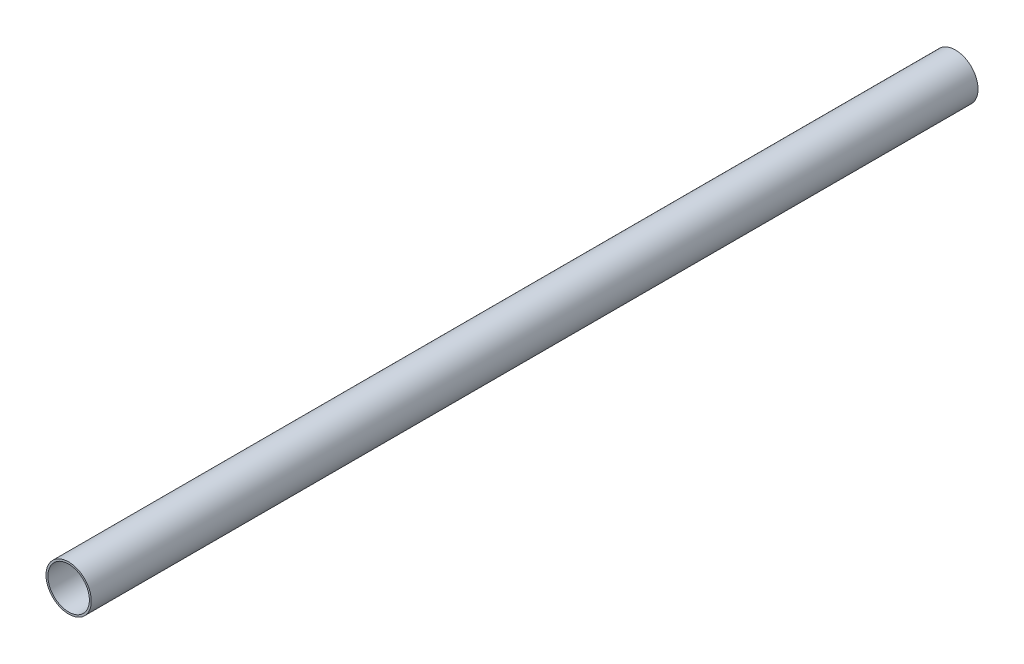
ISO-10303-21;
HEADER;
FILE_DESCRIPTION(('STEP AP214'),'2;1');
FILE_NAME('part.step','',(''),(''),'','','');
FILE_SCHEMA(('AUTOMOTIVE_DESIGN { 1 0 10303 214 1 1 1 1 }'));
ENDSEC;
DATA;
#1=APPLICATION_CONTEXT('core data for automotive mechanical design processes');
#2=APPLICATION_PROTOCOL_DEFINITION('international standard','automotive_design',2000,#1);
#3=PRODUCT_CONTEXT('',#1,'mechanical');
#4=PRODUCT('Part','Part','',(#3));
#5=PRODUCT_RELATED_PRODUCT_CATEGORY('part','',(#4));
#6=PRODUCT_DEFINITION_FORMATION('','',#4);
#7=PRODUCT_DEFINITION_CONTEXT('part definition',#1,'design');
#8=PRODUCT_DEFINITION('design','',#6,#7);
#9=PRODUCT_DEFINITION_SHAPE('','',#8);
#10=(LENGTH_UNIT() NAMED_UNIT(*) SI_UNIT(.MILLI.,.METRE.));
#11=(NAMED_UNIT(*) PLANE_ANGLE_UNIT() SI_UNIT($,.RADIAN.));
#12=(NAMED_UNIT(*) SI_UNIT($,.STERADIAN.) SOLID_ANGLE_UNIT());
#13=UNCERTAINTY_MEASURE_WITH_UNIT(LENGTH_MEASURE(1.E-05),#10,'distance_accuracy_value','');
#14=(GEOMETRIC_REPRESENTATION_CONTEXT(3) GLOBAL_UNCERTAINTY_ASSIGNED_CONTEXT((#13)) GLOBAL_UNIT_ASSIGNED_CONTEXT((#10,
#11,#12)) REPRESENTATION_CONTEXT('',''));
#15=CARTESIAN_POINT('',(0.,0.,0.));
#16=DIRECTION('',(0.,0.,1.));
#17=DIRECTION('',(1.,0.,0.));
#18=AXIS2_PLACEMENT_3D('',#15,#16,#17);
#19=CARTESIAN_POINT('',(0.,0.,470.));
#20=DIRECTION('',(0.,0.,1.));
#21=DIRECTION('',(1.,0.,0.));
#22=AXIS2_PLACEMENT_3D('',#19,#20,#21);
#23=PLANE('',#22);
#24=CARTESIAN_POINT('',(0.,0.,470.));
#25=DIRECTION('',(0.,0.,1.));
#26=DIRECTION('',(1.,0.,0.));
#27=AXIS2_PLACEMENT_3D('',#24,#25,#26);
#28=CIRCLE('',#27,12.);
#29=CARTESIAN_POINT('',(-12.,0.,470.));
#30=VERTEX_POINT('',#29);
#31=EDGE_CURVE('E10',#30,#30,#28,.T.);
#32=ORIENTED_EDGE('',*,*,#31,.T.);
#33=EDGE_LOOP('',(#32));
#34=FACE_BOUND('',#33,.T.);
#35=CARTESIAN_POINT('',(0.,0.,470.));
#36=DIRECTION('',(0.,0.,1.));
#37=DIRECTION('',(1.,0.,0.));
#38=AXIS2_PLACEMENT_3D('',#35,#36,#37);
#39=CIRCLE('',#38,11.);
#40=CARTESIAN_POINT('',(-11.,0.,470.));
#41=VERTEX_POINT('',#40);
#42=EDGE_CURVE('E45',#41,#41,#39,.T.);
#43=ORIENTED_EDGE('',*,*,#42,.F.);
#44=EDGE_LOOP('',(#43));
#45=FACE_BOUND('',#44,.T.);
#46=ADVANCED_FACE('F34',(#34,#45),#23,.T.);
#47=CARTESIAN_POINT('',(0.,0.,0.));
#48=DIRECTION('',(0.,0.,1.));
#49=DIRECTION('',(1.,0.,0.));
#50=AXIS2_PLACEMENT_3D('',#47,#48,#49);
#51=PLANE('',#50);
#52=CARTESIAN_POINT('',(0.,0.,0.));
#53=DIRECTION('',(0.,0.,1.));
#54=DIRECTION('',(1.,0.,0.));
#55=AXIS2_PLACEMENT_3D('',#52,#53,#54);
#56=CIRCLE('',#55,12.);
#57=CARTESIAN_POINT('',(-12.,0.,0.));
#58=VERTEX_POINT('',#57);
#59=EDGE_CURVE('E38',#58,#58,#56,.T.);
#60=ORIENTED_EDGE('',*,*,#59,.F.);
#61=EDGE_LOOP('',(#60));
#62=FACE_BOUND('',#61,.T.);
#63=CARTESIAN_POINT('',(0.,0.,0.));
#64=DIRECTION('',(0.,0.,1.));
#65=DIRECTION('',(1.,0.,0.));
#66=AXIS2_PLACEMENT_3D('',#63,#64,#65);
#67=CIRCLE('',#66,11.);
#68=CARTESIAN_POINT('',(-11.,0.,0.));
#69=VERTEX_POINT('',#68);
#70=EDGE_CURVE('E47',#69,#69,#67,.T.);
#71=ORIENTED_EDGE('',*,*,#70,.T.);
#72=EDGE_LOOP('',(#71));
#73=FACE_BOUND('',#72,.T.);
#74=ADVANCED_FACE('F57',(#62,#73),#51,.F.);
#75=CARTESIAN_POINT('',(0.,0.,470.));
#76=DIRECTION('',(0.,0.,-1.));
#77=DIRECTION('',(-1.,0.,0.));
#78=AXIS2_PLACEMENT_3D('',#75,#76,#77);
#79=CYLINDRICAL_SURFACE('',#78,12.);
#80=CARTESIAN_POINT('',(-12.,0.,470.));
#81=CARTESIAN_POINT('',(-12.,0.,465.104166666667));
#82=CARTESIAN_POINT('',(-12.,0.,460.208333333333));
#83=CARTESIAN_POINT('',(-12.,0.,450.416666666667));
#84=CARTESIAN_POINT('',(-12.,0.,445.520833333333));
#85=CARTESIAN_POINT('',(-12.,0.,435.729166666667));
#86=CARTESIAN_POINT('',(-12.,0.,430.833333333333));
#87=CARTESIAN_POINT('',(-12.,0.,421.041666666667));
#88=CARTESIAN_POINT('',(-12.,0.,416.145833333333));
#89=CARTESIAN_POINT('',(-12.,0.,406.354166666667));
#90=CARTESIAN_POINT('',(-12.,0.,401.458333333333));
#91=CARTESIAN_POINT('',(-12.,0.,391.666666666667));
#92=CARTESIAN_POINT('',(-12.,0.,386.770833333333));
#93=CARTESIAN_POINT('',(-12.,0.,376.979166666667));
#94=CARTESIAN_POINT('',(-12.,0.,372.083333333333));
#95=CARTESIAN_POINT('',(-12.,0.,362.291666666667));
#96=CARTESIAN_POINT('',(-12.,0.,357.395833333333));
#97=CARTESIAN_POINT('',(-12.,0.,347.604166666667));
#98=CARTESIAN_POINT('',(-12.,0.,342.708333333333));
#99=CARTESIAN_POINT('',(-12.,0.,332.916666666667));
#100=CARTESIAN_POINT('',(-12.,0.,328.020833333333));
#101=CARTESIAN_POINT('',(-12.,0.,318.229166666667));
#102=CARTESIAN_POINT('',(-12.,0.,313.333333333333));
#103=CARTESIAN_POINT('',(-12.,0.,303.541666666667));
#104=CARTESIAN_POINT('',(-12.,0.,298.645833333333));
#105=CARTESIAN_POINT('',(-12.,0.,288.854166666667));
#106=CARTESIAN_POINT('',(-12.,0.,283.958333333333));
#107=CARTESIAN_POINT('',(-12.,0.,274.166666666667));
#108=CARTESIAN_POINT('',(-12.,0.,269.270833333333));
#109=CARTESIAN_POINT('',(-12.,0.,259.479166666667));
#110=CARTESIAN_POINT('',(-12.,0.,254.583333333333));
#111=CARTESIAN_POINT('',(-12.,0.,244.791666666667));
#112=CARTESIAN_POINT('',(-12.,0.,239.895833333333));
#113=CARTESIAN_POINT('',(-12.,0.,230.104166666667));
#114=CARTESIAN_POINT('',(-12.,0.,225.208333333333));
#115=CARTESIAN_POINT('',(-12.,0.,215.416666666667));
#116=CARTESIAN_POINT('',(-12.,0.,210.520833333333));
#117=CARTESIAN_POINT('',(-12.,0.,200.729166666667));
#118=CARTESIAN_POINT('',(-12.,0.,195.833333333333));
#119=CARTESIAN_POINT('',(-12.,0.,186.041666666667));
#120=CARTESIAN_POINT('',(-12.,0.,181.145833333333));
#121=CARTESIAN_POINT('',(-12.,0.,171.354166666667));
#122=CARTESIAN_POINT('',(-12.,0.,166.458333333333));
#123=CARTESIAN_POINT('',(-12.,0.,156.666666666667));
#124=CARTESIAN_POINT('',(-12.,0.,151.770833333333));
#125=CARTESIAN_POINT('',(-12.,0.,141.979166666667));
#126=CARTESIAN_POINT('',(-12.,0.,137.083333333333));
#127=CARTESIAN_POINT('',(-12.,0.,127.291666666667));
#128=CARTESIAN_POINT('',(-12.,0.,122.395833333333));
#129=CARTESIAN_POINT('',(-12.,0.,112.604166666667));
#130=CARTESIAN_POINT('',(-12.,0.,107.708333333333));
#131=CARTESIAN_POINT('',(-12.,0.,97.9166666666666));
#132=CARTESIAN_POINT('',(-12.,0.,93.0208333333333));
#133=CARTESIAN_POINT('',(-12.,0.,83.2291666666666));
#134=CARTESIAN_POINT('',(-12.,0.,78.3333333333333));
#135=CARTESIAN_POINT('',(-12.,0.,68.5416666666666));
#136=CARTESIAN_POINT('',(-12.,0.,63.6458333333333));
#137=CARTESIAN_POINT('',(-12.,0.,53.8541666666666));
#138=CARTESIAN_POINT('',(-12.,0.,48.9583333333333));
#139=CARTESIAN_POINT('',(-12.,0.,39.1666666666666));
#140=CARTESIAN_POINT('',(-12.,0.,34.2708333333333));
#141=CARTESIAN_POINT('',(-12.,0.,24.4791666666666));
#142=CARTESIAN_POINT('',(-12.,0.,19.5833333333333));
#143=CARTESIAN_POINT('',(-12.,0.,9.79166666666662));
#144=CARTESIAN_POINT('',(-12.,0.,4.89583333333328));
#145=CARTESIAN_POINT('',(-12.,0.,0.));
#146=B_SPLINE_CURVE_WITH_KNOTS('',3,(#80,#81,#82,#83,#84,#85,#86,#87,#88,#89,#90,#91,#92,#93,
#94,#95,#96,#97,#98,#99,#100,#101,#102,#103,#104,#105,#106,#107,#108,#109,#110,#111,#112,#113,
#114,#115,#116,#117,#118,#119,#120,#121,#122,#123,#124,#125,#126,#127,#128,#129,#130,#131,#132,
#133,#134,#135,#136,#137,#138,#139,#140,#141,#142,#143,#144,#145),.UNSPECIFIED.,.F.,.F.,(4,2,2,
2,2,2,2,2,2,2,2,2,2,2,2,2,2,2,2,2,2,2,2,2,2,2,2,2,2,2,2,2,4),(0.,14.6875,29.375,44.0625,58.75,
73.4375,88.125,102.8125,117.5,132.1875,146.875,161.5625,176.25,190.9375,205.625,220.3125,235.,
249.6875,264.375,279.0625,293.75,308.4375,323.125,337.8125,352.5,367.1875,381.875,396.5625,
411.25,425.9375,440.625,455.3125,470.),.UNSPECIFIED.);
#147=EDGE_CURVE('BSEAM36',#30,#58,#146,.T.);
#148=ORIENTED_EDGE('',*,*,#31,.F.);
#149=ORIENTED_EDGE('',*,*,#59,.T.);
#150=ORIENTED_EDGE('',*,*,#147,.T.);
#151=ORIENTED_EDGE('',*,*,#147,.F.);
#152=EDGE_LOOP('',(#148,#150,#149,#151));
#153=FACE_BOUND('',#152,.T.);
#154=ADVANCED_FACE('F36',(#153),#79,.T.);
#155=CARTESIAN_POINT('',(0.,0.,470.));
#156=DIRECTION('',(0.,0.,-1.));
#157=DIRECTION('',(-1.,0.,0.));
#158=AXIS2_PLACEMENT_3D('',#155,#156,#157);
#159=CYLINDRICAL_SURFACE('',#158,11.);
#160=CARTESIAN_POINT('',(-11.,0.,470.));
#161=CARTESIAN_POINT('',(-11.,0.,465.104166666667));
#162=CARTESIAN_POINT('',(-11.,0.,460.208333333333));
#163=CARTESIAN_POINT('',(-11.,0.,450.416666666667));
#164=CARTESIAN_POINT('',(-11.,0.,445.520833333333));
#165=CARTESIAN_POINT('',(-11.,0.,435.729166666667));
#166=CARTESIAN_POINT('',(-11.,0.,430.833333333333));
#167=CARTESIAN_POINT('',(-11.,0.,421.041666666667));
#168=CARTESIAN_POINT('',(-11.,0.,416.145833333333));
#169=CARTESIAN_POINT('',(-11.,0.,406.354166666667));
#170=CARTESIAN_POINT('',(-11.,0.,401.458333333333));
#171=CARTESIAN_POINT('',(-11.,0.,391.666666666667));
#172=CARTESIAN_POINT('',(-11.,0.,386.770833333333));
#173=CARTESIAN_POINT('',(-11.,0.,376.979166666667));
#174=CARTESIAN_POINT('',(-11.,0.,372.083333333333));
#175=CARTESIAN_POINT('',(-11.,0.,362.291666666667));
#176=CARTESIAN_POINT('',(-11.,0.,357.395833333333));
#177=CARTESIAN_POINT('',(-11.,0.,347.604166666667));
#178=CARTESIAN_POINT('',(-11.,0.,342.708333333333));
#179=CARTESIAN_POINT('',(-11.,0.,332.916666666667));
#180=CARTESIAN_POINT('',(-11.,0.,328.020833333333));
#181=CARTESIAN_POINT('',(-11.,0.,318.229166666667));
#182=CARTESIAN_POINT('',(-11.,0.,313.333333333333));
#183=CARTESIAN_POINT('',(-11.,0.,303.541666666667));
#184=CARTESIAN_POINT('',(-11.,0.,298.645833333333));
#185=CARTESIAN_POINT('',(-11.,0.,288.854166666667));
#186=CARTESIAN_POINT('',(-11.,0.,283.958333333333));
#187=CARTESIAN_POINT('',(-11.,0.,274.166666666667));
#188=CARTESIAN_POINT('',(-11.,0.,269.270833333333));
#189=CARTESIAN_POINT('',(-11.,0.,259.479166666667));
#190=CARTESIAN_POINT('',(-11.,0.,254.583333333333));
#191=CARTESIAN_POINT('',(-11.,0.,244.791666666667));
#192=CARTESIAN_POINT('',(-11.,0.,239.895833333333));
#193=CARTESIAN_POINT('',(-11.,0.,230.104166666667));
#194=CARTESIAN_POINT('',(-11.,0.,225.208333333333));
#195=CARTESIAN_POINT('',(-11.,0.,215.416666666667));
#196=CARTESIAN_POINT('',(-11.,0.,210.520833333333));
#197=CARTESIAN_POINT('',(-11.,0.,200.729166666667));
#198=CARTESIAN_POINT('',(-11.,0.,195.833333333333));
#199=CARTESIAN_POINT('',(-11.,0.,186.041666666667));
#200=CARTESIAN_POINT('',(-11.,0.,181.145833333333));
#201=CARTESIAN_POINT('',(-11.,0.,171.354166666667));
#202=CARTESIAN_POINT('',(-11.,0.,166.458333333333));
#203=CARTESIAN_POINT('',(-11.,0.,156.666666666667));
#204=CARTESIAN_POINT('',(-11.,0.,151.770833333333));
#205=CARTESIAN_POINT('',(-11.,0.,141.979166666667));
#206=CARTESIAN_POINT('',(-11.,0.,137.083333333333));
#207=CARTESIAN_POINT('',(-11.,0.,127.291666666667));
#208=CARTESIAN_POINT('',(-11.,0.,122.395833333333));
#209=CARTESIAN_POINT('',(-11.,0.,112.604166666667));
#210=CARTESIAN_POINT('',(-11.,0.,107.708333333333));
#211=CARTESIAN_POINT('',(-11.,0.,97.9166666666666));
#212=CARTESIAN_POINT('',(-11.,0.,93.0208333333333));
#213=CARTESIAN_POINT('',(-11.,0.,83.2291666666666));
#214=CARTESIAN_POINT('',(-11.,0.,78.3333333333333));
#215=CARTESIAN_POINT('',(-11.,0.,68.5416666666666));
#216=CARTESIAN_POINT('',(-11.,0.,63.6458333333333));
#217=CARTESIAN_POINT('',(-11.,0.,53.8541666666666));
#218=CARTESIAN_POINT('',(-11.,0.,48.9583333333333));
#219=CARTESIAN_POINT('',(-11.,0.,39.1666666666666));
#220=CARTESIAN_POINT('',(-11.,0.,34.2708333333333));
#221=CARTESIAN_POINT('',(-11.,0.,24.4791666666666));
#222=CARTESIAN_POINT('',(-11.,0.,19.5833333333333));
#223=CARTESIAN_POINT('',(-11.,0.,9.79166666666662));
#224=CARTESIAN_POINT('',(-11.,0.,4.89583333333328));
#225=CARTESIAN_POINT('',(-11.,0.,0.));
#226=B_SPLINE_CURVE_WITH_KNOTS('',3,(#160,#161,#162,#163,#164,#165,#166,#167,#168,#169,#170,
#171,#172,#173,#174,#175,#176,#177,#178,#179,#180,#181,#182,#183,#184,#185,#186,#187,#188,#189,
#190,#191,#192,#193,#194,#195,#196,#197,#198,#199,#200,#201,#202,#203,#204,#205,#206,#207,#208,
#209,#210,#211,#212,#213,#214,#215,#216,#217,#218,#219,#220,#221,#222,#223,#224,#225),
.UNSPECIFIED.,.F.,.F.,(4,2,2,2,2,2,2,2,2,2,2,2,2,2,2,2,2,2,2,2,2,2,2,2,2,2,2,2,2,2,2,2,4),(0.,
14.6875,29.375,44.0625,58.75,73.4375,88.125,102.8125,117.5,132.1875,146.875,161.5625,176.25,
190.9375,205.625,220.3125,235.,249.6875,264.375,279.0625,293.75,308.4375,323.125,337.8125,352.5,
367.1875,381.875,396.5625,411.25,425.9375,440.625,455.3125,470.),.UNSPECIFIED.);
#227=EDGE_CURVE('BSEAM53',#41,#69,#226,.T.);
#228=ORIENTED_EDGE('',*,*,#42,.T.);
#229=ORIENTED_EDGE('',*,*,#70,.F.);
#230=ORIENTED_EDGE('',*,*,#227,.T.);
#231=ORIENTED_EDGE('',*,*,#227,.F.);
#232=EDGE_LOOP('',(#228,#230,#229,#231));
#233=FACE_BOUND('',#232,.T.);
#234=ADVANCED_FACE('F53',(#233),#159,.F.);
#235=CLOSED_SHELL('',(#46,#74,#154,#234));
#236=MANIFOLD_SOLID_BREP('B2',#235);
#237=ADVANCED_BREP_SHAPE_REPRESENTATION('',(#18,#236),#14);
#238=SHAPE_DEFINITION_REPRESENTATION(#9,#237);
ENDSEC;
END-ISO-10303-21;
